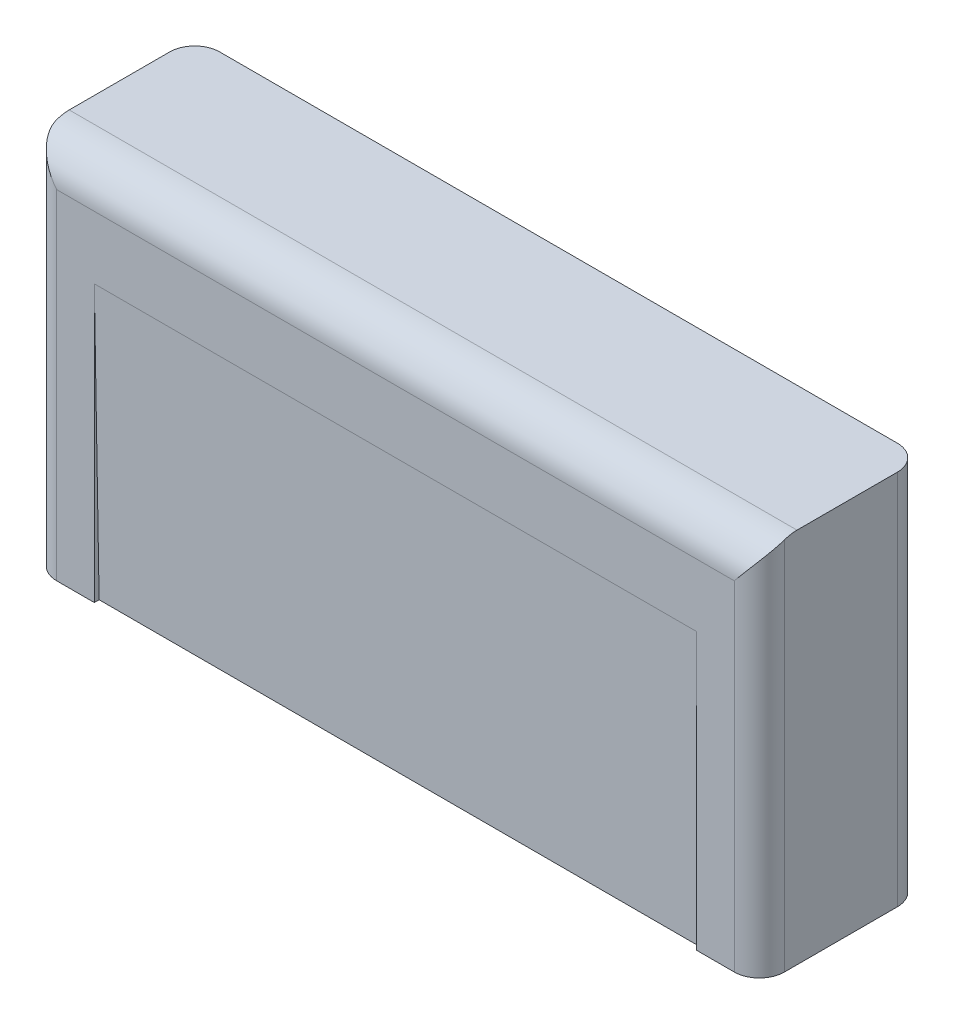
ISO-10303-21;
HEADER;
FILE_DESCRIPTION(('STEP AP214'),'2;1');
FILE_NAME('part.step','',(''),(''),'','','');
FILE_SCHEMA(('AUTOMOTIVE_DESIGN { 1 0 10303 214 1 1 1 1 }'));
ENDSEC;
DATA;
#1=APPLICATION_CONTEXT('core data for automotive mechanical design processes');
#2=APPLICATION_PROTOCOL_DEFINITION('international standard','automotive_design',2000,#1);
#3=PRODUCT_CONTEXT('',#1,'mechanical');
#4=PRODUCT('Part','Part','',(#3));
#5=PRODUCT_RELATED_PRODUCT_CATEGORY('part','',(#4));
#6=PRODUCT_DEFINITION_FORMATION('','',#4);
#7=PRODUCT_DEFINITION_CONTEXT('part definition',#1,'design');
#8=PRODUCT_DEFINITION('design','',#6,#7);
#9=PRODUCT_DEFINITION_SHAPE('','',#8);
#10=(LENGTH_UNIT() NAMED_UNIT(*) SI_UNIT(.MILLI.,.METRE.));
#11=(NAMED_UNIT(*) PLANE_ANGLE_UNIT() SI_UNIT($,.RADIAN.));
#12=(NAMED_UNIT(*) SI_UNIT($,.STERADIAN.) SOLID_ANGLE_UNIT());
#13=UNCERTAINTY_MEASURE_WITH_UNIT(LENGTH_MEASURE(1.E-05),#10,'distance_accuracy_value','');
#14=(GEOMETRIC_REPRESENTATION_CONTEXT(3) GLOBAL_UNCERTAINTY_ASSIGNED_CONTEXT((#13)) GLOBAL_UNIT_ASSIGNED_CONTEXT((#10,
#11,#12)) REPRESENTATION_CONTEXT('',''));
#15=CARTESIAN_POINT('',(0.,0.,0.));
#16=DIRECTION('',(0.,0.,1.));
#17=DIRECTION('',(1.,0.,0.));
#18=AXIS2_PLACEMENT_3D('',#15,#16,#17);
#19=CARTESIAN_POINT('',(-29.,-30.,6.5));
#20=DIRECTION('',(0.,0.,1.));
#21=DIRECTION('',(1.,0.,0.));
#22=AXIS2_PLACEMENT_3D('',#19,#20,#21);
#23=PLANE('',#22);
#24=DIRECTION('',(1.,0.,0.));
#25=VECTOR('',#24,1.);
#26=CARTESIAN_POINT('',(-29.,-30.,6.5));
#27=LINE('',#26,#25);
#28=CARTESIAN_POINT('',(-27.,-30.,6.5));
#29=VERTEX_POINT('',#28);
#30=CARTESIAN_POINT('',(-24.,-30.,6.5));
#31=VERTEX_POINT('',#30);
#32=EDGE_CURVE('E161',#29,#31,#27,.T.);
#33=ORIENTED_EDGE('',*,*,#32,.T.);
#34=DIRECTION('',(0.,-1.,0.));
#35=VECTOR('',#34,1.);
#36=CARTESIAN_POINT('',(-24.,-30.,6.5));
#37=LINE('',#36,#35);
#38=CARTESIAN_POINT('',(-24.,-8.,6.5));
#39=VERTEX_POINT('',#38);
#40=EDGE_CURVE('E147',#39,#31,#37,.T.);
#41=ORIENTED_EDGE('',*,*,#40,.F.);
#42=DIRECTION('',(1.,0.,0.));
#43=VECTOR('',#42,1.);
#44=CARTESIAN_POINT('',(-24.,-8.,6.5));
#45=LINE('',#44,#43);
#46=CARTESIAN_POINT('',(24.,-8.,6.5));
#47=VERTEX_POINT('',#46);
#48=EDGE_CURVE('E290',#39,#47,#45,.T.);
#49=ORIENTED_EDGE('',*,*,#48,.T.);
#50=DIRECTION('',(0.,-1.,0.));
#51=VECTOR('',#50,1.);
#52=CARTESIAN_POINT('',(24.,-30.,6.5));
#53=LINE('',#52,#51);
#54=CARTESIAN_POINT('',(24.,-30.,6.5));
#55=VERTEX_POINT('',#54);
#56=EDGE_CURVE('E296',#47,#55,#53,.T.);
#57=ORIENTED_EDGE('',*,*,#56,.T.);
#58=CARTESIAN_POINT('',(27.,-30.,6.5));
#59=VERTEX_POINT('',#58);
#60=EDGE_CURVE('E168',#55,#59,#27,.T.);
#61=ORIENTED_EDGE('',*,*,#60,.T.);
#62=DIRECTION('',(0.,1.,0.));
#63=VECTOR('',#62,1.);
#64=CARTESIAN_POINT('',(27.,-30.,6.5));
#65=LINE('',#64,#63);
#66=CARTESIAN_POINT('',(27.,-3.,6.5));
#67=VERTEX_POINT('',#66);
#68=EDGE_CURVE('E205',#59,#67,#65,.T.);
#69=ORIENTED_EDGE('',*,*,#68,.T.);
#70=DIRECTION('',(1.,0.,0.));
#71=VECTOR('',#70,1.);
#72=CARTESIAN_POINT('',(-27.,-3.,6.5));
#73=LINE('',#72,#71);
#74=CARTESIAN_POINT('',(-27.,-3.,6.5));
#75=VERTEX_POINT('',#74);
#76=EDGE_CURVE('E225',#67,#75,#73,.F.);
#77=ORIENTED_EDGE('',*,*,#76,.T.);
#78=DIRECTION('',(0.,1.,0.));
#79=VECTOR('',#78,1.);
#80=CARTESIAN_POINT('',(-27.,-30.,6.5));
#81=LINE('',#80,#79);
#82=EDGE_CURVE('E166',#75,#29,#81,.F.);
#83=ORIENTED_EDGE('',*,*,#82,.T.);
#84=EDGE_LOOP('',(#33,#41,#49,#57,#61,#69,#77,#83));
#85=FACE_BOUND('',#84,.T.);
#86=ADVANCED_FACE('F51',(#85),#23,.T.);
#87=CARTESIAN_POINT('',(0.,-30.,0.));
#88=DIRECTION('',(0.,-1.,0.));
#89=DIRECTION('',(0.,0.,-1.));
#90=AXIS2_PLACEMENT_3D('',#87,#88,#89);
#91=PLANE('',#90);
#92=CARTESIAN_POINT('',(21.5,-30.,0.));
#93=DIRECTION('',(0.,-1.,0.));
#94=DIRECTION('',(0.,0.,-1.));
#95=AXIS2_PLACEMENT_3D('',#92,#93,#94);
#96=CIRCLE('',#95,3.025);
#97=CARTESIAN_POINT('',(21.5,-30.,-3.025));
#98=VERTEX_POINT('',#97);
#99=EDGE_CURVE('E287',#98,#98,#96,.T.);
#100=ORIENTED_EDGE('',*,*,#99,.F.);
#101=EDGE_LOOP('',(#100));
#102=FACE_BOUND('',#101,.T.);
#103=CARTESIAN_POINT('',(-21.5,-30.,0.));
#104=DIRECTION('',(0.,-1.,0.));
#105=DIRECTION('',(0.,0.,-1.));
#106=AXIS2_PLACEMENT_3D('',#103,#104,#105);
#107=CIRCLE('',#106,3.025);
#108=CARTESIAN_POINT('',(-21.5,-30.,-3.025));
#109=VERTEX_POINT('',#108);
#110=EDGE_CURVE('E278',#109,#109,#107,.T.);
#111=ORIENTED_EDGE('',*,*,#110,.F.);
#112=EDGE_LOOP('',(#111));
#113=FACE_BOUND('',#112,.T.);
#114=DIRECTION('',(1.,0.,0.));
#115=VECTOR('',#114,1.);
#116=CARTESIAN_POINT('',(-24.,-30.,6.11598857157936));
#117=LINE('',#116,#115);
#118=CARTESIAN_POINT('',(-24.,-30.,6.11598857157936));
#119=VERTEX_POINT('',#118);
#120=CARTESIAN_POINT('',(24.,-30.,6.11598857157936));
#121=VERTEX_POINT('',#120);
#122=EDGE_CURVE('E164',#119,#121,#117,.T.);
#123=ORIENTED_EDGE('',*,*,#122,.F.);
#124=DIRECTION('',(0.,0.,-1.));
#125=VECTOR('',#124,1.);
#126=CARTESIAN_POINT('',(-24.,-30.,6.11598857157936));
#127=LINE('',#126,#125);
#128=EDGE_CURVE('E150',#31,#119,#127,.T.);
#129=ORIENTED_EDGE('',*,*,#128,.F.);
#130=ORIENTED_EDGE('',*,*,#32,.F.);
#131=CARTESIAN_POINT('',(-27.,-30.,4.5));
#132=DIRECTION('',(0.,-1.,0.));
#133=DIRECTION('',(0.,0.,-1.));
#134=AXIS2_PLACEMENT_3D('',#131,#132,#133);
#135=CIRCLE('',#134,2.);
#136=CARTESIAN_POINT('',(-29.,-30.,4.5));
#137=VERTEX_POINT('',#136);
#138=EDGE_CURVE('E201',#29,#137,#135,.T.);
#139=ORIENTED_EDGE('',*,*,#138,.T.);
#140=DIRECTION('',(0.,0.,1.));
#141=VECTOR('',#140,1.);
#142=CARTESIAN_POINT('',(-29.,-30.,6.5));
#143=LINE('',#142,#141);
#144=CARTESIAN_POINT('',(-29.,-30.,-4.5));
#145=VERTEX_POINT('',#144);
#146=EDGE_CURVE('E172',#145,#137,#143,.T.);
#147=ORIENTED_EDGE('',*,*,#146,.F.);
#148=CARTESIAN_POINT('',(-27.,-30.,-4.5));
#149=DIRECTION('',(0.,-1.,0.));
#150=DIRECTION('',(0.,0.,-1.));
#151=AXIS2_PLACEMENT_3D('',#148,#149,#150);
#152=CIRCLE('',#151,2.);
#153=CARTESIAN_POINT('',(-27.,-30.,-6.5));
#154=VERTEX_POINT('',#153);
#155=EDGE_CURVE('E203',#145,#154,#152,.T.);
#156=ORIENTED_EDGE('',*,*,#155,.T.);
#157=DIRECTION('',(-1.,0.,0.));
#158=VECTOR('',#157,1.);
#159=CARTESIAN_POINT('',(-29.,-30.,-6.5));
#160=LINE('',#159,#158);
#161=CARTESIAN_POINT('',(27.,-30.,-6.5));
#162=VERTEX_POINT('',#161);
#163=EDGE_CURVE('E268',#162,#154,#160,.T.);
#164=ORIENTED_EDGE('',*,*,#163,.F.);
#165=CARTESIAN_POINT('',(27.,-30.,-4.5));
#166=DIRECTION('',(0.,-1.,0.));
#167=DIRECTION('',(0.,0.,-1.));
#168=AXIS2_PLACEMENT_3D('',#165,#166,#167);
#169=CIRCLE('',#168,2.);
#170=CARTESIAN_POINT('',(29.,-30.,-4.49999999999999));
#171=VERTEX_POINT('',#170);
#172=EDGE_CURVE('E199',#162,#171,#169,.T.);
#173=ORIENTED_EDGE('',*,*,#172,.T.);
#174=DIRECTION('',(0.,0.,-1.));
#175=VECTOR('',#174,1.);
#176=CARTESIAN_POINT('',(29.,-30.,6.5));
#177=LINE('',#176,#175);
#178=CARTESIAN_POINT('',(29.,-30.,4.5));
#179=VERTEX_POINT('',#178);
#180=EDGE_CURVE('E184',#179,#171,#177,.T.);
#181=ORIENTED_EDGE('',*,*,#180,.F.);
#182=CARTESIAN_POINT('',(27.,-30.,4.5));
#183=DIRECTION('',(0.,-1.,0.));
#184=DIRECTION('',(0.,0.,-1.));
#185=AXIS2_PLACEMENT_3D('',#182,#183,#184);
#186=CIRCLE('',#185,2.);
#187=EDGE_CURVE('E196',#179,#59,#186,.T.);
#188=ORIENTED_EDGE('',*,*,#187,.T.);
#189=ORIENTED_EDGE('',*,*,#60,.F.);
#190=DIRECTION('',(0.,0.,-1.));
#191=VECTOR('',#190,1.);
#192=CARTESIAN_POINT('',(24.,-30.,6.11598857157936));
#193=LINE('',#192,#191);
#194=EDGE_CURVE('E294',#55,#121,#193,.T.);
#195=ORIENTED_EDGE('',*,*,#194,.T.);
#196=EDGE_LOOP('',(#123,#129,#130,#139,#147,#156,#164,#173,#181,#188,#189,#195));
#197=FACE_BOUND('',#196,.T.);
#198=ADVANCED_FACE('F160',(#102,#113,#197),#91,.T.);
#199=CARTESIAN_POINT('',(29.,-30.,6.5));
#200=DIRECTION('',(1.,0.,0.));
#201=DIRECTION('',(0.,0.,-1.));
#202=AXIS2_PLACEMENT_3D('',#199,#200,#201);
#203=PLANE('',#202);
#204=DIRECTION('',(0.,0.,-1.));
#205=VECTOR('',#204,1.);
#206=CARTESIAN_POINT('',(29.,0.,6.5));
#207=LINE('',#206,#205);
#208=CARTESIAN_POINT('',(29.,0.,3.5));
#209=VERTEX_POINT('',#208);
#210=CARTESIAN_POINT('',(29.,0.,-4.49999999999999));
#211=VERTEX_POINT('',#210);
#212=EDGE_CURVE('E176',#209,#211,#207,.T.);
#213=ORIENTED_EDGE('',*,*,#212,.F.);
#214=CARTESIAN_POINT('',(29.,-3.,3.5));
#215=DIRECTION('',(1.,0.,0.));
#216=DIRECTION('',(0.,0.,-1.));
#217=AXIS2_PLACEMENT_3D('',#214,#215,#216);
#218=CIRCLE('',#217,3.);
#219=CARTESIAN_POINT('',(29.,-0.171572875253809,4.5));
#220=VERTEX_POINT('',#219);
#221=EDGE_CURVE('E217',#209,#220,#218,.T.);
#222=ORIENTED_EDGE('',*,*,#221,.T.);
#223=DIRECTION('',(0.,1.,0.));
#224=VECTOR('',#223,1.);
#225=CARTESIAN_POINT('',(29.,-30.,4.5));
#226=LINE('',#225,#224);
#227=EDGE_CURVE('E209',#220,#179,#226,.F.);
#228=ORIENTED_EDGE('',*,*,#227,.T.);
#229=ORIENTED_EDGE('',*,*,#180,.T.);
#230=DIRECTION('',(0.,1.,0.));
#231=VECTOR('',#230,1.);
#232=CARTESIAN_POINT('',(29.,-30.,-4.5));
#233=LINE('',#232,#231);
#234=EDGE_CURVE('E211',#171,#211,#233,.T.);
#235=ORIENTED_EDGE('',*,*,#234,.T.);
#236=EDGE_LOOP('',(#213,#222,#228,#229,#235));
#237=FACE_BOUND('',#236,.T.);
#238=ADVANCED_FACE('F304',(#237),#203,.T.);
#239=CARTESIAN_POINT('',(-29.,-30.,6.5));
#240=DIRECTION('',(-1.,0.,0.));
#241=DIRECTION('',(0.,0.,1.));
#242=AXIS2_PLACEMENT_3D('',#239,#240,#241);
#243=PLANE('',#242);
#244=DIRECTION('',(0.,1.,0.));
#245=VECTOR('',#244,1.);
#246=CARTESIAN_POINT('',(-29.,-30.,4.5));
#247=LINE('',#246,#245);
#248=CARTESIAN_POINT('',(-29.,-0.17157287525381,4.5));
#249=VERTEX_POINT('',#248);
#250=EDGE_CURVE('E192',#137,#249,#247,.T.);
#251=ORIENTED_EDGE('',*,*,#250,.T.);
#252=CARTESIAN_POINT('',(-29.,-3.,3.5));
#253=DIRECTION('',(-1.,0.,0.));
#254=DIRECTION('',(0.,0.,1.));
#255=AXIS2_PLACEMENT_3D('',#252,#253,#254);
#256=CIRCLE('',#255,3.);
#257=CARTESIAN_POINT('',(-29.,0.,3.5));
#258=VERTEX_POINT('',#257);
#259=EDGE_CURVE('E11',#249,#258,#256,.T.);
#260=ORIENTED_EDGE('',*,*,#259,.T.);
#261=DIRECTION('',(0.,0.,1.));
#262=VECTOR('',#261,1.);
#263=CARTESIAN_POINT('',(-29.,0.,6.5));
#264=LINE('',#263,#262);
#265=CARTESIAN_POINT('',(-29.,0.,-4.5));
#266=VERTEX_POINT('',#265);
#267=EDGE_CURVE('E182',#266,#258,#264,.T.);
#268=ORIENTED_EDGE('',*,*,#267,.F.);
#269=DIRECTION('',(0.,1.,0.));
#270=VECTOR('',#269,1.);
#271=CARTESIAN_POINT('',(-29.,-30.,-4.5));
#272=LINE('',#271,#270);
#273=EDGE_CURVE('E194',#266,#145,#272,.F.);
#274=ORIENTED_EDGE('',*,*,#273,.T.);
#275=ORIENTED_EDGE('',*,*,#146,.T.);
#276=EDGE_LOOP('',(#251,#260,#268,#274,#275));
#277=FACE_BOUND('',#276,.T.);
#278=ADVANCED_FACE('F253',(#277),#243,.T.);
#279=CARTESIAN_POINT('',(-29.,-30.,-6.5));
#280=DIRECTION('',(0.,0.,-1.));
#281=DIRECTION('',(-1.,0.,0.));
#282=AXIS2_PLACEMENT_3D('',#279,#280,#281);
#283=PLANE('',#282);
#284=ORIENTED_EDGE('',*,*,#163,.T.);
#285=DIRECTION('',(0.,1.,0.));
#286=VECTOR('',#285,1.);
#287=CARTESIAN_POINT('',(-27.,-30.,-6.5));
#288=LINE('',#287,#286);
#289=CARTESIAN_POINT('',(-27.,0.,-6.5));
#290=VERTEX_POINT('',#289);
#291=EDGE_CURVE('E170',#154,#290,#288,.T.);
#292=ORIENTED_EDGE('',*,*,#291,.T.);
#293=DIRECTION('',(-1.,0.,0.));
#294=VECTOR('',#293,1.);
#295=CARTESIAN_POINT('',(-29.,0.,-6.5));
#296=LINE('',#295,#294);
#297=CARTESIAN_POINT('',(27.,0.,-6.5));
#298=VERTEX_POINT('',#297);
#299=EDGE_CURVE('E178',#298,#290,#296,.T.);
#300=ORIENTED_EDGE('',*,*,#299,.F.);
#301=DIRECTION('',(0.,1.,0.));
#302=VECTOR('',#301,1.);
#303=CARTESIAN_POINT('',(27.,-30.,-6.5));
#304=LINE('',#303,#302);
#305=EDGE_CURVE('E167',#298,#162,#304,.F.);
#306=ORIENTED_EDGE('',*,*,#305,.T.);
#307=EDGE_LOOP('',(#284,#292,#300,#306));
#308=FACE_BOUND('',#307,.T.);
#309=ADVANCED_FACE('F265',(#308),#283,.T.);
#310=CARTESIAN_POINT('',(0.,0.,0.));
#311=DIRECTION('',(0.,-1.,0.));
#312=DIRECTION('',(0.,0.,-1.));
#313=AXIS2_PLACEMENT_3D('',#310,#311,#312);
#314=PLANE('',#313);
#315=ORIENTED_EDGE('',*,*,#267,.T.);
#316=DIRECTION('',(1.,0.,0.));
#317=VECTOR('',#316,1.);
#318=CARTESIAN_POINT('',(27.,0.,3.5));
#319=LINE('',#318,#317);
#320=EDGE_CURVE('E214',#258,#209,#319,.T.);
#321=ORIENTED_EDGE('',*,*,#320,.T.);
#322=ORIENTED_EDGE('',*,*,#212,.T.);
#323=CARTESIAN_POINT('',(27.,0.,-4.5));
#324=DIRECTION('',(0.,-1.,0.));
#325=DIRECTION('',(0.,0.,-1.));
#326=AXIS2_PLACEMENT_3D('',#323,#324,#325);
#327=CIRCLE('',#326,2.);
#328=EDGE_CURVE('E188',#211,#298,#327,.F.);
#329=ORIENTED_EDGE('',*,*,#328,.T.);
#330=ORIENTED_EDGE('',*,*,#299,.T.);
#331=CARTESIAN_POINT('',(-27.,0.,-4.5));
#332=DIRECTION('',(0.,-1.,0.));
#333=DIRECTION('',(0.,0.,-1.));
#334=AXIS2_PLACEMENT_3D('',#331,#332,#333);
#335=CIRCLE('',#334,2.);
#336=EDGE_CURVE('E190',#290,#266,#335,.F.);
#337=ORIENTED_EDGE('',*,*,#336,.T.);
#338=EDGE_LOOP('',(#315,#321,#322,#329,#330,#337));
#339=FACE_BOUND('',#338,.T.);
#340=ADVANCED_FACE('F257',(#339),#314,.F.);
#341=CARTESIAN_POINT('',(-27.,-30.,-4.5));
#342=DIRECTION('',(0.,1.,0.));
#343=DIRECTION('',(0.,0.,1.));
#344=AXIS2_PLACEMENT_3D('',#341,#342,#343);
#345=CYLINDRICAL_SURFACE('',#344,2.);
#346=ORIENTED_EDGE('',*,*,#155,.F.);
#347=ORIENTED_EDGE('',*,*,#273,.F.);
#348=ORIENTED_EDGE('',*,*,#336,.F.);
#349=ORIENTED_EDGE('',*,*,#291,.F.);
#350=EDGE_LOOP('',(#346,#347,#348,#349));
#351=FACE_BOUND('',#350,.T.);
#352=ADVANCED_FACE('F239',(#351),#345,.T.);
#353=CARTESIAN_POINT('',(-27.,-30.,4.5));
#354=DIRECTION('',(0.,1.,0.));
#355=DIRECTION('',(0.,0.,1.));
#356=AXIS2_PLACEMENT_3D('',#353,#354,#355);
#357=CYLINDRICAL_SURFACE('',#356,2.);
#358=ORIENTED_EDGE('',*,*,#82,.F.);
#359=CARTESIAN_POINT('',(-29.,-0.171572875253809,4.5));
#360=CARTESIAN_POINT('',(-29.0000084449649,-0.19149294973119,4.55638405555257));
#361=CARTESIAN_POINT('',(-28.9976165290429,-0.213113026951954,4.61213090524145));
#362=CARTESIAN_POINT('',(-28.9884161031397,-0.259452787780404,4.72185097214105));
#363=CARTESIAN_POINT('',(-28.9816143557198,-0.284167678685312,4.775826772357));
#364=CARTESIAN_POINT('',(-28.9640650089645,-0.336195675457501,4.88114703210529));
#365=CARTESIAN_POINT('',(-28.9533578782159,-0.363480077625335,4.93251253251163));
#366=CARTESIAN_POINT('',(-28.928383343086,-0.420570081191318,5.03293300898971));
#367=CARTESIAN_POINT('',(-28.9141142613294,-0.450376866033002,5.08198688350807));
#368=CARTESIAN_POINT('',(-28.8593269063569,-0.557235204806668,5.24710684622474));
#369=CARTESIAN_POINT('',(-28.8107991236013,-0.639990691269771,5.35695114231588));
#370=CARTESIAN_POINT('',(-28.699579870891,-0.815528183344867,5.56066196172696));
#371=CARTESIAN_POINT('',(-28.6368256750297,-0.908353613562805,5.65445439532711));
#372=CARTESIAN_POINT('',(-28.4749333169946,-1.13830760334613,5.85925720363039));
#373=CARTESIAN_POINT('',(-28.3711102120254,-1.27868584193729,5.96289727870954));
#374=CARTESIAN_POINT('',(-28.1512915720566,-1.56777829054138,6.14153331793483));
#375=CARTESIAN_POINT('',(-28.0352792281827,-1.71650387636299,6.2164890478937));
#376=CARTESIAN_POINT('',(-27.8432419274776,-1.95911372234939,6.31536669032298));
#377=CARTESIAN_POINT('',(-27.769505033522,-2.05147691559188,6.34775479636274));
#378=CARTESIAN_POINT('',(-27.6201250475232,-2.23748721104575,6.40310220476015));
#379=CARTESIAN_POINT('',(-27.5444813343817,-2.33113472694339,6.42605839166327));
#380=CARTESIAN_POINT('',(-27.3160659756586,-2.6128902505375,6.48105514873023));
#381=CARTESIAN_POINT('',(-27.1613491422724,-2.8023883258855,6.4994534063341));
#382=CARTESIAN_POINT('',(-27.0046187313569,-2.99434323024004,6.49999599518123));
#383=CARTESIAN_POINT('',(-27.002309327745,-2.99717166041595,6.49999999478464));
#384=CARTESIAN_POINT('',(-27.,-3.,6.5));
#385=B_SPLINE_CURVE_WITH_KNOTS('',3,(#359,#360,#361,#362,#363,#364,#365,#366,#367,#368,#369,
#370,#371,#372,#373,#374,#375,#376,#377,#378,#379,#380,#381,#382,#383,#384),.UNSPECIFIED.,.F.,
.F.,(4,2,2,2,2,2,2,2,2,2,2,2,4),(0.,0.17927215882423,0.358270048541726,0.53546349492526,
0.712740542250161,1.14766579663324,1.58454732757419,2.19039501983592,2.79708941843105,
3.16434808038175,3.53172795410125,4.26418943717289,4.2751438948957),.UNSPECIFIED.);
#386=EDGE_CURVE('E60',#75,#249,#385,.F.);
#387=ORIENTED_EDGE('',*,*,#386,.T.);
#388=ORIENTED_EDGE('',*,*,#250,.F.);
#389=ORIENTED_EDGE('',*,*,#138,.F.);
#390=EDGE_LOOP('',(#358,#387,#388,#389));
#391=FACE_BOUND('',#390,.T.);
#392=ADVANCED_FACE('F234',(#391),#357,.T.);
#393=CARTESIAN_POINT('',(27.,-30.,-4.5));
#394=DIRECTION('',(0.,1.,0.));
#395=DIRECTION('',(0.,0.,1.));
#396=AXIS2_PLACEMENT_3D('',#393,#394,#395);
#397=CYLINDRICAL_SURFACE('',#396,2.);
#398=ORIENTED_EDGE('',*,*,#172,.F.);
#399=ORIENTED_EDGE('',*,*,#305,.F.);
#400=ORIENTED_EDGE('',*,*,#328,.F.);
#401=ORIENTED_EDGE('',*,*,#234,.F.);
#402=EDGE_LOOP('',(#398,#399,#400,#401));
#403=FACE_BOUND('',#402,.T.);
#404=ADVANCED_FACE('F230',(#403),#397,.T.);
#405=CARTESIAN_POINT('',(27.,-30.,4.5));
#406=DIRECTION('',(0.,1.,0.));
#407=DIRECTION('',(0.,0.,1.));
#408=AXIS2_PLACEMENT_3D('',#405,#406,#407);
#409=CYLINDRICAL_SURFACE('',#408,2.);
#410=ORIENTED_EDGE('',*,*,#227,.F.);
#411=CARTESIAN_POINT('',(29.,-0.171572875253809,4.5));
#412=CARTESIAN_POINT('',(29.0000084449649,-0.19149294973119,4.55638405555257));
#413=CARTESIAN_POINT('',(28.9976165290429,-0.213113026951955,4.61213090524145));
#414=CARTESIAN_POINT('',(28.9884161031397,-0.259452787780405,4.72185097214105));
#415=CARTESIAN_POINT('',(28.9816143557198,-0.284167678685313,4.775826772357));
#416=CARTESIAN_POINT('',(28.9640650089645,-0.336195675457502,4.88114703210529));
#417=CARTESIAN_POINT('',(28.9533578782159,-0.363480077625335,4.93251253251163));
#418=CARTESIAN_POINT('',(28.928383343086,-0.420570081191318,5.03293300898972));
#419=CARTESIAN_POINT('',(28.9141142613294,-0.450376866033002,5.08198688350808));
#420=CARTESIAN_POINT('',(28.8593269063569,-0.557235204806669,5.24710684622474));
#421=CARTESIAN_POINT('',(28.8107991236013,-0.639990691269772,5.35695114231588));
#422=CARTESIAN_POINT('',(28.699579870891,-0.815528183344867,5.56066196172696));
#423=CARTESIAN_POINT('',(28.6368256750297,-0.908353613562806,5.65445439532711));
#424=CARTESIAN_POINT('',(28.4749333169946,-1.13830760334613,5.85925720363039));
#425=CARTESIAN_POINT('',(28.3711102120254,-1.27868584193729,5.96289727870954));
#426=CARTESIAN_POINT('',(28.1512915720566,-1.56777829054138,6.14153331793483));
#427=CARTESIAN_POINT('',(28.0352792281827,-1.71650387636299,6.2164890478937));
#428=CARTESIAN_POINT('',(27.8432419274776,-1.95911372234939,6.31536669032298));
#429=CARTESIAN_POINT('',(27.7695050335219,-2.05147691559188,6.34775479636274));
#430=CARTESIAN_POINT('',(27.6201250475232,-2.23748721104575,6.40310220476015));
#431=CARTESIAN_POINT('',(27.5444813343817,-2.33113472694339,6.42605839166327));
#432=CARTESIAN_POINT('',(27.3160659756586,-2.6128902505375,6.48105514873023));
#433=CARTESIAN_POINT('',(27.1613491422724,-2.8023883258855,6.4994534063341));
#434=CARTESIAN_POINT('',(27.0046187313569,-2.99434323024004,6.49999599518123));
#435=CARTESIAN_POINT('',(27.002309327745,-2.99717166041595,6.49999999478464));
#436=CARTESIAN_POINT('',(27.,-3.,6.5));
#437=B_SPLINE_CURVE_WITH_KNOTS('',3,(#411,#412,#413,#414,#415,#416,#417,#418,#419,#420,#421,
#422,#423,#424,#425,#426,#427,#428,#429,#430,#431,#432,#433,#434,#435,#436),.UNSPECIFIED.,.F.,
.F.,(4,2,2,2,2,2,2,2,2,2,2,2,4),(0.,0.179272158824231,0.358270048541727,0.535463494925261,
0.712740542250161,1.14766579663324,1.58454732757419,2.19039501983592,2.79708941843105,
3.16434808038175,3.53172795410125,4.26418943717289,4.2751438948957),.UNSPECIFIED.);
#438=EDGE_CURVE('E219',#220,#67,#437,.T.);
#439=ORIENTED_EDGE('',*,*,#438,.T.);
#440=ORIENTED_EDGE('',*,*,#68,.F.);
#441=ORIENTED_EDGE('',*,*,#187,.F.);
#442=EDGE_LOOP('',(#410,#439,#440,#441));
#443=FACE_BOUND('',#442,.T.);
#444=ADVANCED_FACE('F226',(#443),#409,.T.);
#445=CARTESIAN_POINT('',(0.,-3.,3.5));
#446=DIRECTION('',(-1.,0.,0.));
#447=DIRECTION('',(0.,0.,1.));
#448=AXIS2_PLACEMENT_3D('',#445,#446,#447);
#449=CYLINDRICAL_SURFACE('',#448,3.);
#450=ORIENTED_EDGE('',*,*,#386,.F.);
#451=ORIENTED_EDGE('',*,*,#76,.F.);
#452=ORIENTED_EDGE('',*,*,#438,.F.);
#453=ORIENTED_EDGE('',*,*,#221,.F.);
#454=ORIENTED_EDGE('',*,*,#320,.F.);
#455=ORIENTED_EDGE('',*,*,#259,.F.);
#456=EDGE_LOOP('',(#450,#451,#452,#453,#454,#455));
#457=FACE_BOUND('',#456,.T.);
#458=ADVANCED_FACE('F53',(#457),#449,.T.);
#459=CARTESIAN_POINT('',(-21.5,-13.,0.));
#460=DIRECTION('',(0.,-1.,0.));
#461=DIRECTION('',(0.,0.,-1.));
#462=AXIS2_PLACEMENT_3D('',#459,#460,#461);
#463=CONICAL_SURFACE('',#462,2.49999999999999,1.02974425867665);
#464=CARTESIAN_POINT('',(-21.5,-11.4978484524311,0.));
#465=VERTEX_POINT('',#464);
#466=VERTEX_LOOP('',#465);
#467=FACE_BOUND('',#466,.T.);
#468=CARTESIAN_POINT('',(-21.5,-13.,0.));
#469=DIRECTION('',(0.,-1.,0.));
#470=DIRECTION('',(0.,0.,-1.));
#471=AXIS2_PLACEMENT_3D('',#468,#469,#470);
#472=CIRCLE('',#471,2.49999999999999);
#473=CARTESIAN_POINT('',(-21.5,-13.,-2.49999999999999));
#474=VERTEX_POINT('',#473);
#475=EDGE_CURVE('E179',#474,#474,#472,.T.);
#476=ORIENTED_EDGE('',*,*,#475,.T.);
#477=EDGE_LOOP('',(#476));
#478=FACE_BOUND('',#477,.T.);
#479=ADVANCED_FACE('F356',(#467,#478),#463,.F.);
#480=CARTESIAN_POINT('',(-21.5,-30.,0.));
#481=DIRECTION('',(0.,-1.,0.));
#482=DIRECTION('',(0.,0.,-1.));
#483=AXIS2_PLACEMENT_3D('',#480,#481,#482);
#484=CYLINDRICAL_SURFACE('',#483,2.49999999999999);
#485=ORIENTED_EDGE('',*,*,#475,.F.);
#486=EDGE_LOOP('',(#485));
#487=FACE_BOUND('',#486,.T.);
#488=CARTESIAN_POINT('',(-21.5,-29.475,0.));
#489=DIRECTION('',(0.,-1.,0.));
#490=DIRECTION('',(0.,0.,-1.));
#491=AXIS2_PLACEMENT_3D('',#488,#489,#490);
#492=CIRCLE('',#491,2.5);
#493=CARTESIAN_POINT('',(-21.5,-29.475,-2.5));
#494=VERTEX_POINT('',#493);
#495=EDGE_CURVE('E275',#494,#494,#492,.T.);
#496=ORIENTED_EDGE('',*,*,#495,.T.);
#497=EDGE_LOOP('',(#496));
#498=FACE_BOUND('',#497,.T.);
#499=ADVANCED_FACE('F364',(#487,#498),#484,.F.);
#500=CARTESIAN_POINT('',(-21.5,-30.,0.));
#501=DIRECTION('',(0.,-1.,0.));
#502=DIRECTION('',(0.,0.,-1.));
#503=AXIS2_PLACEMENT_3D('',#500,#501,#502);
#504=CONICAL_SURFACE('',#503,3.025,0.785398163397448);
#505=ORIENTED_EDGE('',*,*,#495,.F.);
#506=EDGE_LOOP('',(#505));
#507=FACE_BOUND('',#506,.T.);
#508=ORIENTED_EDGE('',*,*,#110,.T.);
#509=EDGE_LOOP('',(#508));
#510=FACE_BOUND('',#509,.T.);
#511=ADVANCED_FACE('F375',(#507,#510),#504,.F.);
#512=CARTESIAN_POINT('',(21.5,-13.,0.));
#513=DIRECTION('',(0.,-1.,0.));
#514=DIRECTION('',(0.,0.,-1.));
#515=AXIS2_PLACEMENT_3D('',#512,#513,#514);
#516=CONICAL_SURFACE('',#515,2.49999999999999,1.02974425867665);
#517=CARTESIAN_POINT('',(21.5,-11.4978484524311,0.));
#518=VERTEX_POINT('',#517);
#519=VERTEX_LOOP('',#518);
#520=FACE_BOUND('',#519,.T.);
#521=CARTESIAN_POINT('',(21.5,-13.,0.));
#522=DIRECTION('',(0.,-1.,0.));
#523=DIRECTION('',(0.,0.,-1.));
#524=AXIS2_PLACEMENT_3D('',#521,#522,#523);
#525=CIRCLE('',#524,2.49999999999999);
#526=CARTESIAN_POINT('',(21.5,-13.,-2.49999999999999));
#527=VERTEX_POINT('',#526);
#528=EDGE_CURVE('E281',#527,#527,#525,.T.);
#529=ORIENTED_EDGE('',*,*,#528,.T.);
#530=EDGE_LOOP('',(#529));
#531=FACE_BOUND('',#530,.T.);
#532=ADVANCED_FACE('F387',(#520,#531),#516,.F.);
#533=CARTESIAN_POINT('',(21.5,-30.,0.));
#534=DIRECTION('',(0.,-1.,0.));
#535=DIRECTION('',(0.,0.,-1.));
#536=AXIS2_PLACEMENT_3D('',#533,#534,#535);
#537=CYLINDRICAL_SURFACE('',#536,2.49999999999999);
#538=ORIENTED_EDGE('',*,*,#528,.F.);
#539=EDGE_LOOP('',(#538));
#540=FACE_BOUND('',#539,.T.);
#541=CARTESIAN_POINT('',(21.5,-29.475,0.));
#542=DIRECTION('',(0.,-1.,0.));
#543=DIRECTION('',(0.,0.,-1.));
#544=AXIS2_PLACEMENT_3D('',#541,#542,#543);
#545=CIRCLE('',#544,2.5);
#546=CARTESIAN_POINT('',(21.5,-29.475,-2.5));
#547=VERTEX_POINT('',#546);
#548=EDGE_CURVE('E284',#547,#547,#545,.T.);
#549=ORIENTED_EDGE('',*,*,#548,.T.);
#550=EDGE_LOOP('',(#549));
#551=FACE_BOUND('',#550,.T.);
#552=ADVANCED_FACE('F397',(#540,#551),#537,.F.);
#553=CARTESIAN_POINT('',(21.5,-30.,0.));
#554=DIRECTION('',(0.,-1.,0.));
#555=DIRECTION('',(0.,0.,-1.));
#556=AXIS2_PLACEMENT_3D('',#553,#554,#555);
#557=CONICAL_SURFACE('',#556,3.025,0.785398163397448);
#558=ORIENTED_EDGE('',*,*,#548,.F.);
#559=EDGE_LOOP('',(#558));
#560=FACE_BOUND('',#559,.T.);
#561=ORIENTED_EDGE('',*,*,#99,.T.);
#562=EDGE_LOOP('',(#561));
#563=FACE_BOUND('',#562,.T.);
#564=ADVANCED_FACE('F408',(#560,#563),#557,.F.);
#565=CARTESIAN_POINT('',(-24.,-8.,6.5));
#566=DIRECTION('',(0.,0.0174524064372768,-0.999847695156391));
#567=DIRECTION('',(0.,0.999847695156391,0.0174524064372768));
#568=AXIS2_PLACEMENT_3D('',#565,#566,#567);
#569=PLANE('',#568);
#570=DIRECTION('',(0.,0.999847695156391,0.0174524064372768));
#571=VECTOR('',#570,1.);
#572=CARTESIAN_POINT('',(24.,-8.,6.5));
#573=LINE('',#572,#571);
#574=EDGE_CURVE('E67',#121,#47,#573,.T.);
#575=ORIENTED_EDGE('',*,*,#574,.T.);
#576=ORIENTED_EDGE('',*,*,#48,.F.);
#577=DIRECTION('',(0.,0.999847695156391,0.0174524064372768));
#578=VECTOR('',#577,1.);
#579=CARTESIAN_POINT('',(-24.,-8.,6.5));
#580=LINE('',#579,#578);
#581=EDGE_CURVE('E152',#119,#39,#580,.T.);
#582=ORIENTED_EDGE('',*,*,#581,.F.);
#583=ORIENTED_EDGE('',*,*,#122,.T.);
#584=EDGE_LOOP('',(#575,#576,#582,#583));
#585=FACE_BOUND('',#584,.T.);
#586=ADVANCED_FACE('F419',(#585),#569,.F.);
#587=CARTESIAN_POINT('',(-24.,0.,0.));
#588=DIRECTION('',(1.,0.,0.));
#589=DIRECTION('',(0.,0.,-1.));
#590=AXIS2_PLACEMENT_3D('',#587,#588,#589);
#591=PLANE('',#590);
#592=ORIENTED_EDGE('',*,*,#40,.T.);
#593=ORIENTED_EDGE('',*,*,#128,.T.);
#594=ORIENTED_EDGE('',*,*,#581,.T.);
#595=EDGE_LOOP('',(#592,#593,#594));
#596=FACE_BOUND('',#595,.T.);
#597=ADVANCED_FACE('F149',(#596),#591,.T.);
#598=CARTESIAN_POINT('',(24.,0.,0.));
#599=DIRECTION('',(1.,0.,0.));
#600=DIRECTION('',(0.,0.,-1.));
#601=AXIS2_PLACEMENT_3D('',#598,#599,#600);
#602=PLANE('',#601);
#603=ORIENTED_EDGE('',*,*,#56,.F.);
#604=ORIENTED_EDGE('',*,*,#574,.F.);
#605=ORIENTED_EDGE('',*,*,#194,.F.);
#606=EDGE_LOOP('',(#603,#604,#605));
#607=FACE_BOUND('',#606,.T.);
#608=ADVANCED_FACE('F450',(#607),#602,.F.);
#609=CLOSED_SHELL('',(#86,#198,#238,#278,#309,#340,#352,#392,#404,#444,#458,#479,#499,#511,#532,
#552,#564,#586,#597,#608));
#610=MANIFOLD_SOLID_BREP('B2',#609);
#611=ADVANCED_BREP_SHAPE_REPRESENTATION('',(#18,#610),#14);
#612=SHAPE_DEFINITION_REPRESENTATION(#9,#611);
ENDSEC;
END-ISO-10303-21;
